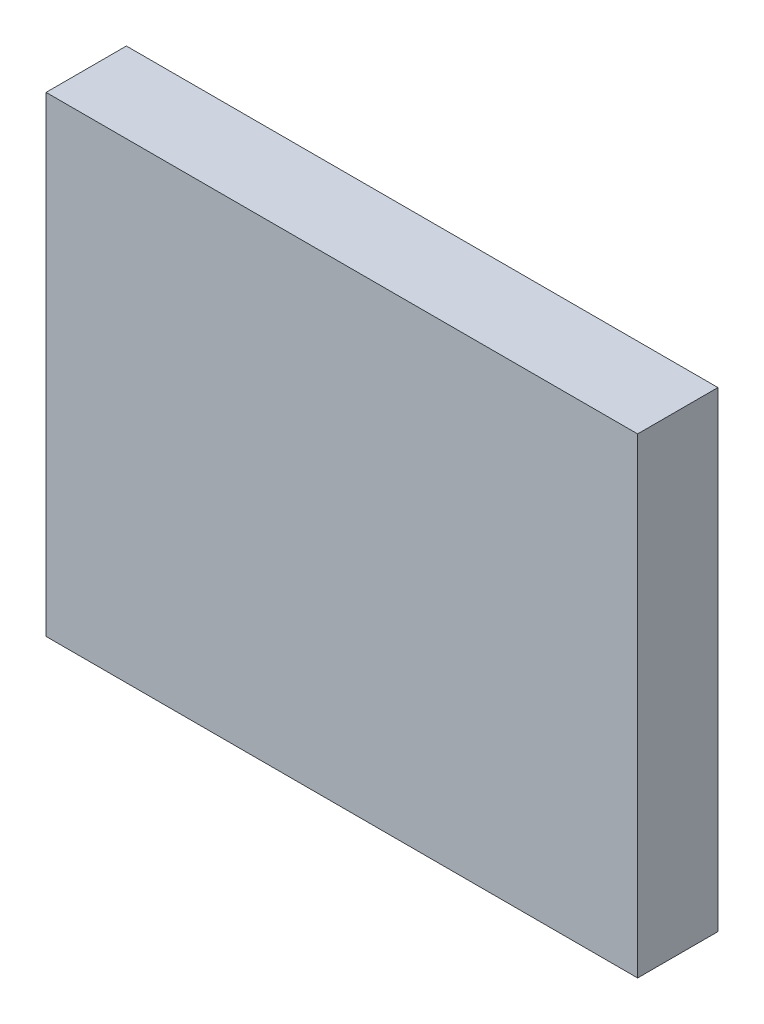
ISO-10303-21;
HEADER;
FILE_DESCRIPTION(('STEP AP214'),'2;1');
FILE_NAME('part.step','',(''),(''),'','','');
FILE_SCHEMA(('AUTOMOTIVE_DESIGN { 1 0 10303 214 1 1 1 1 }'));
ENDSEC;
DATA;
#1=APPLICATION_CONTEXT('core data for automotive mechanical design processes');
#2=APPLICATION_PROTOCOL_DEFINITION('international standard','automotive_design',2000,#1);
#3=PRODUCT_CONTEXT('',#1,'mechanical');
#4=PRODUCT('Part','Part','',(#3));
#5=PRODUCT_RELATED_PRODUCT_CATEGORY('part','',(#4));
#6=PRODUCT_DEFINITION_FORMATION('','',#4);
#7=PRODUCT_DEFINITION_CONTEXT('part definition',#1,'design');
#8=PRODUCT_DEFINITION('design','',#6,#7);
#9=PRODUCT_DEFINITION_SHAPE('','',#8);
#10=(LENGTH_UNIT() NAMED_UNIT(*) SI_UNIT(.MILLI.,.METRE.));
#11=(NAMED_UNIT(*) PLANE_ANGLE_UNIT() SI_UNIT($,.RADIAN.));
#12=(NAMED_UNIT(*) SI_UNIT($,.STERADIAN.) SOLID_ANGLE_UNIT());
#13=UNCERTAINTY_MEASURE_WITH_UNIT(LENGTH_MEASURE(1.E-05),#10,'distance_accuracy_value','');
#14=(GEOMETRIC_REPRESENTATION_CONTEXT(3) GLOBAL_UNCERTAINTY_ASSIGNED_CONTEXT((#13)) GLOBAL_UNIT_ASSIGNED_CONTEXT((#10,
#11,#12)) REPRESENTATION_CONTEXT('',''));
#15=CARTESIAN_POINT('',(0.,0.,0.));
#16=DIRECTION('',(0.,0.,1.));
#17=DIRECTION('',(1.,0.,0.));
#18=AXIS2_PLACEMENT_3D('',#15,#16,#17);
#19=CARTESIAN_POINT('',(0.,0.,10.));
#20=DIRECTION('',(1.,0.,0.));
#21=DIRECTION('',(0.,0.,-1.));
#22=AXIS2_PLACEMENT_3D('',#19,#20,#21);
#23=PLANE('',#22);
#24=DIRECTION('',(0.,-1.,0.));
#25=VECTOR('',#24,1.);
#26=CARTESIAN_POINT('',(0.,0.,0.));
#27=LINE('',#26,#25);
#28=CARTESIAN_POINT('',(0.,58.674,0.));
#29=VERTEX_POINT('',#28);
#30=CARTESIAN_POINT('',(0.,0.,0.));
#31=VERTEX_POINT('',#30);
#32=EDGE_CURVE('E98',#29,#31,#27,.T.);
#33=ORIENTED_EDGE('',*,*,#32,.T.);
#34=DIRECTION('',(0.,0.,-1.));
#35=VECTOR('',#34,1.);
#36=CARTESIAN_POINT('',(0.,0.,10.));
#37=LINE('',#36,#35);
#38=CARTESIAN_POINT('',(0.,0.,10.));
#39=VERTEX_POINT('',#38);
#40=EDGE_CURVE('E11',#39,#31,#37,.T.);
#41=ORIENTED_EDGE('',*,*,#40,.F.);
#42=DIRECTION('',(0.,-1.,0.));
#43=VECTOR('',#42,1.);
#44=CARTESIAN_POINT('',(0.,0.,10.));
#45=LINE('',#44,#43);
#46=CARTESIAN_POINT('',(0.,58.674,10.));
#47=VERTEX_POINT('',#46);
#48=EDGE_CURVE('E86',#47,#39,#45,.T.);
#49=ORIENTED_EDGE('',*,*,#48,.F.);
#50=DIRECTION('',(0.,0.,-1.));
#51=VECTOR('',#50,1.);
#52=CARTESIAN_POINT('',(0.,58.674,10.));
#53=LINE('',#52,#51);
#54=EDGE_CURVE('E94',#47,#29,#53,.T.);
#55=ORIENTED_EDGE('',*,*,#54,.T.);
#56=EDGE_LOOP('',(#33,#41,#49,#55));
#57=FACE_BOUND('',#56,.T.);
#58=ADVANCED_FACE('F35',(#57),#23,.F.);
#59=CARTESIAN_POINT('',(0.,0.,10.));
#60=DIRECTION('',(0.,1.,0.));
#61=DIRECTION('',(0.,0.,1.));
#62=AXIS2_PLACEMENT_3D('',#59,#60,#61);
#63=PLANE('',#62);
#64=DIRECTION('',(1.,0.,0.));
#65=VECTOR('',#64,1.);
#66=CARTESIAN_POINT('',(0.,0.,0.));
#67=LINE('',#66,#65);
#68=CARTESIAN_POINT('',(73.66,0.,0.));
#69=VERTEX_POINT('',#68);
#70=EDGE_CURVE('E90',#31,#69,#67,.T.);
#71=ORIENTED_EDGE('',*,*,#70,.T.);
#72=DIRECTION('',(0.,0.,-1.));
#73=VECTOR('',#72,1.);
#74=CARTESIAN_POINT('',(73.66,0.,10.));
#75=LINE('',#74,#73);
#76=CARTESIAN_POINT('',(73.66,0.,10.));
#77=VERTEX_POINT('',#76);
#78=EDGE_CURVE('E43',#77,#69,#75,.T.);
#79=ORIENTED_EDGE('',*,*,#78,.F.);
#80=DIRECTION('',(1.,0.,0.));
#81=VECTOR('',#80,1.);
#82=CARTESIAN_POINT('',(0.,0.,10.));
#83=LINE('',#82,#81);
#84=EDGE_CURVE('E81',#39,#77,#83,.T.);
#85=ORIENTED_EDGE('',*,*,#84,.F.);
#86=ORIENTED_EDGE('',*,*,#40,.T.);
#87=EDGE_LOOP('',(#71,#79,#85,#86));
#88=FACE_BOUND('',#87,.T.);
#89=ADVANCED_FACE('F89',(#88),#63,.F.);
#90=CARTESIAN_POINT('',(73.66,58.674,10.));
#91=DIRECTION('',(-1.,0.,0.));
#92=DIRECTION('',(0.,0.,1.));
#93=AXIS2_PLACEMENT_3D('',#90,#91,#92);
#94=PLANE('',#93);
#95=DIRECTION('',(0.,1.,0.));
#96=VECTOR('',#95,1.);
#97=CARTESIAN_POINT('',(73.66,58.674,0.));
#98=LINE('',#97,#96);
#99=CARTESIAN_POINT('',(73.66,58.674,0.));
#100=VERTEX_POINT('',#99);
#101=EDGE_CURVE('E68',#69,#100,#98,.T.);
#102=ORIENTED_EDGE('',*,*,#101,.T.);
#103=DIRECTION('',(0.,0.,-1.));
#104=VECTOR('',#103,1.);
#105=CARTESIAN_POINT('',(73.66,58.674,10.));
#106=LINE('',#105,#104);
#107=CARTESIAN_POINT('',(73.66,58.674,10.));
#108=VERTEX_POINT('',#107);
#109=EDGE_CURVE('E91',#108,#100,#106,.T.);
#110=ORIENTED_EDGE('',*,*,#109,.F.);
#111=DIRECTION('',(0.,1.,0.));
#112=VECTOR('',#111,1.);
#113=CARTESIAN_POINT('',(73.66,58.674,10.));
#114=LINE('',#113,#112);
#115=EDGE_CURVE('E84',#77,#108,#114,.T.);
#116=ORIENTED_EDGE('',*,*,#115,.F.);
#117=ORIENTED_EDGE('',*,*,#78,.T.);
#118=EDGE_LOOP('',(#102,#110,#116,#117));
#119=FACE_BOUND('',#118,.T.);
#120=ADVANCED_FACE('F92',(#119),#94,.F.);
#121=CARTESIAN_POINT('',(0.,58.674,10.));
#122=DIRECTION('',(0.,-1.,0.));
#123=DIRECTION('',(0.,0.,-1.));
#124=AXIS2_PLACEMENT_3D('',#121,#122,#123);
#125=PLANE('',#124);
#126=DIRECTION('',(-1.,0.,0.));
#127=VECTOR('',#126,1.);
#128=CARTESIAN_POINT('',(0.,58.674,0.));
#129=LINE('',#128,#127);
#130=EDGE_CURVE('E74',#100,#29,#129,.T.);
#131=ORIENTED_EDGE('',*,*,#130,.T.);
#132=ORIENTED_EDGE('',*,*,#54,.F.);
#133=DIRECTION('',(-1.,0.,0.));
#134=VECTOR('',#133,1.);
#135=CARTESIAN_POINT('',(0.,58.674,10.));
#136=LINE('',#135,#134);
#137=EDGE_CURVE('E51',#108,#47,#136,.T.);
#138=ORIENTED_EDGE('',*,*,#137,.F.);
#139=ORIENTED_EDGE('',*,*,#109,.T.);
#140=EDGE_LOOP('',(#131,#132,#138,#139));
#141=FACE_BOUND('',#140,.T.);
#142=ADVANCED_FACE('F105',(#141),#125,.F.);
#143=CARTESIAN_POINT('',(0.,58.674,10.));
#144=DIRECTION('',(0.,0.,-1.));
#145=DIRECTION('',(-1.,0.,0.));
#146=AXIS2_PLACEMENT_3D('',#143,#144,#145);
#147=PLANE('',#146);
#148=ORIENTED_EDGE('',*,*,#48,.T.);
#149=ORIENTED_EDGE('',*,*,#84,.T.);
#150=ORIENTED_EDGE('',*,*,#115,.T.);
#151=ORIENTED_EDGE('',*,*,#137,.T.);
#152=EDGE_LOOP('',(#148,#149,#150,#151));
#153=FACE_BOUND('',#152,.T.);
#154=ADVANCED_FACE('F82',(#153),#147,.F.);
#155=CARTESIAN_POINT('',(0.,58.674,0.));
#156=DIRECTION('',(0.,0.,-1.));
#157=DIRECTION('',(-1.,0.,0.));
#158=AXIS2_PLACEMENT_3D('',#155,#156,#157);
#159=PLANE('',#158);
#160=ORIENTED_EDGE('',*,*,#32,.F.);
#161=ORIENTED_EDGE('',*,*,#130,.F.);
#162=ORIENTED_EDGE('',*,*,#101,.F.);
#163=ORIENTED_EDGE('',*,*,#70,.F.);
#164=EDGE_LOOP('',(#160,#161,#162,#163));
#165=FACE_BOUND('',#164,.T.);
#166=ADVANCED_FACE('F108',(#165),#159,.T.);
#167=CLOSED_SHELL('',(#58,#89,#120,#142,#154,#166));
#168=MANIFOLD_SOLID_BREP('B2',#167);
#169=ADVANCED_BREP_SHAPE_REPRESENTATION('',(#18,#168),#14);
#170=SHAPE_DEFINITION_REPRESENTATION(#9,#169);
ENDSEC;
END-ISO-10303-21;
